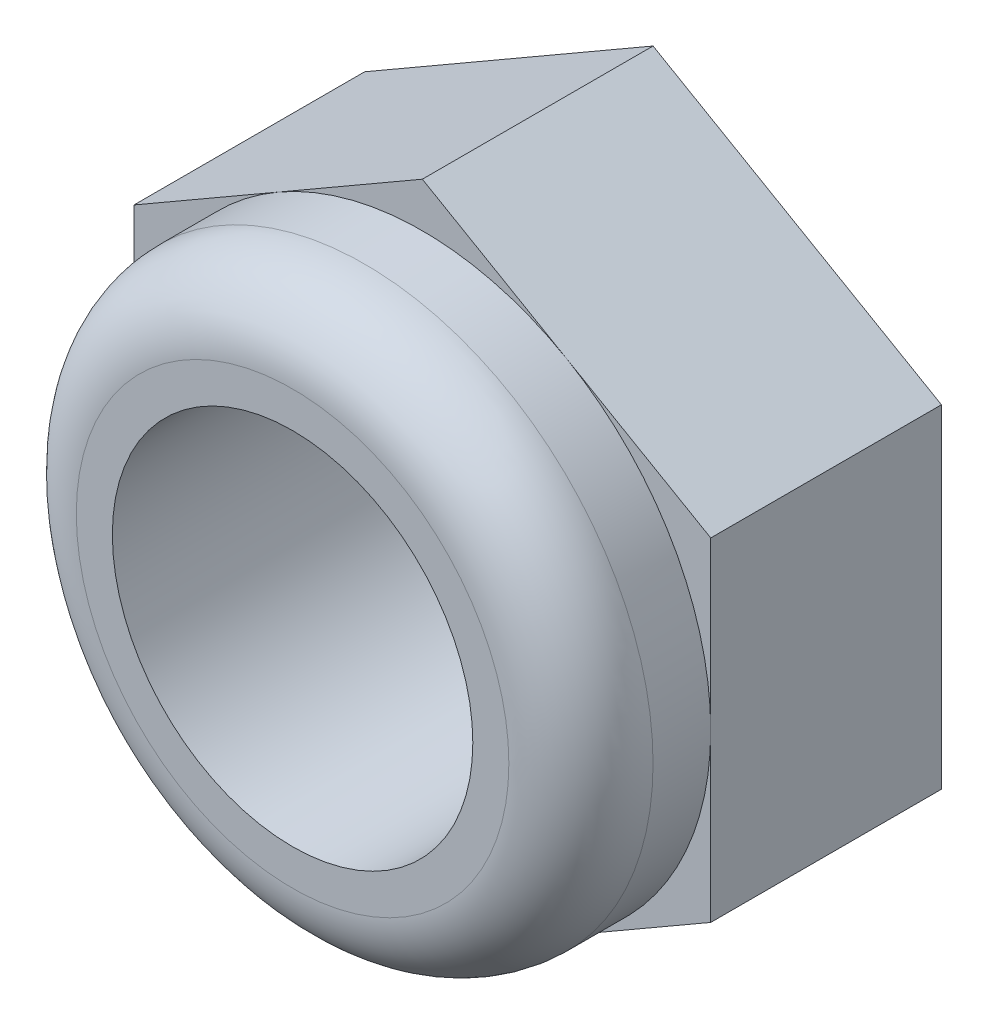
ISO-10303-21;
HEADER;
FILE_DESCRIPTION(('STEP AP214'),'2;1');
FILE_NAME('part.step','',(''),(''),'','','');
FILE_SCHEMA(('AUTOMOTIVE_DESIGN { 1 0 10303 214 1 1 1 1 }'));
ENDSEC;
DATA;
#1=APPLICATION_CONTEXT('core data for automotive mechanical design processes');
#2=APPLICATION_PROTOCOL_DEFINITION('international standard','automotive_design',2000,#1);
#3=PRODUCT_CONTEXT('',#1,'mechanical');
#4=PRODUCT('Part','Part','',(#3));
#5=PRODUCT_RELATED_PRODUCT_CATEGORY('part','',(#4));
#6=PRODUCT_DEFINITION_FORMATION('','',#4);
#7=PRODUCT_DEFINITION_CONTEXT('part definition',#1,'design');
#8=PRODUCT_DEFINITION('design','',#6,#7);
#9=PRODUCT_DEFINITION_SHAPE('','',#8);
#10=(LENGTH_UNIT() NAMED_UNIT(*) SI_UNIT(.MILLI.,.METRE.));
#11=(NAMED_UNIT(*) PLANE_ANGLE_UNIT() SI_UNIT($,.RADIAN.));
#12=(NAMED_UNIT(*) SI_UNIT($,.STERADIAN.) SOLID_ANGLE_UNIT());
#13=UNCERTAINTY_MEASURE_WITH_UNIT(LENGTH_MEASURE(1.E-05),#10,'distance_accuracy_value','');
#14=(GEOMETRIC_REPRESENTATION_CONTEXT(3) GLOBAL_UNCERTAINTY_ASSIGNED_CONTEXT((#13)) GLOBAL_UNIT_ASSIGNED_CONTEXT((#10,
#11,#12)) REPRESENTATION_CONTEXT('',''));
#15=CARTESIAN_POINT('',(0.,0.,0.));
#16=DIRECTION('',(0.,0.,1.));
#17=DIRECTION('',(1.,0.,0.));
#18=AXIS2_PLACEMENT_3D('',#15,#16,#17);
#19=CARTESIAN_POINT('',(0.,0.,3.2));
#20=DIRECTION('',(0.,0.,1.));
#21=DIRECTION('',(1.,0.,0.));
#22=AXIS2_PLACEMENT_3D('',#19,#20,#21);
#23=PLANE('',#22);
#24=CARTESIAN_POINT('',(0.,0.,3.2));
#25=DIRECTION('',(0.,0.,1.));
#26=DIRECTION('',(1.,0.,0.));
#27=AXIS2_PLACEMENT_3D('',#24,#25,#26);
#28=CIRCLE('',#27,4.);
#29=CARTESIAN_POINT('',(4.,0.,3.2));
#30=VERTEX_POINT('',#29);
#31=CARTESIAN_POINT('',(2.,3.46410161513776,3.2));
#32=VERTEX_POINT('',#31);
#33=EDGE_CURVE('E131',#30,#32,#28,.T.);
#34=ORIENTED_EDGE('',*,*,#33,.F.);
#35=DIRECTION('',(0.,1.,0.));
#36=VECTOR('',#35,1.);
#37=CARTESIAN_POINT('',(4.,-2.3094010767585,3.2));
#38=LINE('',#37,#36);
#39=CARTESIAN_POINT('',(4.,2.30940107675851,3.2));
#40=VERTEX_POINT('',#39);
#41=EDGE_CURVE('E119',#30,#40,#38,.T.);
#42=ORIENTED_EDGE('',*,*,#41,.T.);
#43=DIRECTION('',(-0.866025403784439,0.5,0.));
#44=VECTOR('',#43,1.);
#45=CARTESIAN_POINT('',(4.,2.30940107675851,3.2));
#46=LINE('',#45,#44);
#47=EDGE_CURVE('E132',#40,#32,#46,.T.);
#48=ORIENTED_EDGE('',*,*,#47,.T.);
#49=EDGE_LOOP('',(#34,#42,#48));
#50=FACE_BOUND('',#49,.T.);
#51=ADVANCED_FACE('F36',(#50),#23,.T.);
#52=CARTESIAN_POINT('',(-2.,3.46410161513775,3.2));
#53=VERTEX_POINT('',#52);
#54=EDGE_CURVE('E138',#32,#53,#28,.T.);
#55=ORIENTED_EDGE('',*,*,#54,.F.);
#56=CARTESIAN_POINT('',(0.,4.61880215351701,3.2));
#57=VERTEX_POINT('',#56);
#58=EDGE_CURVE('E118',#32,#57,#46,.T.);
#59=ORIENTED_EDGE('',*,*,#58,.T.);
#60=DIRECTION('',(-0.866025403784438,-0.5,0.));
#61=VECTOR('',#60,1.);
#62=CARTESIAN_POINT('',(0.,4.61880215351701,3.2));
#63=LINE('',#62,#61);
#64=EDGE_CURVE('E149',#57,#53,#63,.T.);
#65=ORIENTED_EDGE('',*,*,#64,.T.);
#66=EDGE_LOOP('',(#55,#59,#65));
#67=FACE_BOUND('',#66,.T.);
#68=ADVANCED_FACE('F197',(#67),#23,.T.);
#69=CARTESIAN_POINT('',(-4.,0.,3.2));
#70=VERTEX_POINT('',#69);
#71=EDGE_CURVE('E186',#53,#70,#28,.T.);
#72=ORIENTED_EDGE('',*,*,#71,.F.);
#73=CARTESIAN_POINT('',(-4.,2.3094010767585,3.2));
#74=VERTEX_POINT('',#73);
#75=EDGE_CURVE('E148',#53,#74,#63,.T.);
#76=ORIENTED_EDGE('',*,*,#75,.T.);
#77=DIRECTION('',(0.,-1.,0.));
#78=VECTOR('',#77,1.);
#79=CARTESIAN_POINT('',(-4.,2.3094010767585,3.2));
#80=LINE('',#79,#78);
#81=EDGE_CURVE('E153',#74,#70,#80,.T.);
#82=ORIENTED_EDGE('',*,*,#81,.T.);
#83=EDGE_LOOP('',(#72,#76,#82));
#84=FACE_BOUND('',#83,.T.);
#85=ADVANCED_FACE('F190',(#84),#23,.T.);
#86=CARTESIAN_POINT('',(-2.,-3.46410161513776,3.2));
#87=VERTEX_POINT('',#86);
#88=EDGE_CURVE('E59',#70,#87,#28,.T.);
#89=ORIENTED_EDGE('',*,*,#88,.F.);
#90=CARTESIAN_POINT('',(-4.,-2.3094010767585,3.2));
#91=VERTEX_POINT('',#90);
#92=EDGE_CURVE('E152',#70,#91,#80,.T.);
#93=ORIENTED_EDGE('',*,*,#92,.T.);
#94=DIRECTION('',(0.866025403784439,-0.5,0.));
#95=VECTOR('',#94,1.);
#96=CARTESIAN_POINT('',(-4.,-2.3094010767585,3.2));
#97=LINE('',#96,#95);
#98=EDGE_CURVE('E157',#91,#87,#97,.T.);
#99=ORIENTED_EDGE('',*,*,#98,.T.);
#100=EDGE_LOOP('',(#89,#93,#99));
#101=FACE_BOUND('',#100,.T.);
#102=ADVANCED_FACE('F216',(#101),#23,.T.);
#103=CARTESIAN_POINT('',(2.,-3.46410161513775,3.2));
#104=VERTEX_POINT('',#103);
#105=EDGE_CURVE('E51',#87,#104,#28,.T.);
#106=ORIENTED_EDGE('',*,*,#105,.F.);
#107=CARTESIAN_POINT('',(0.,-4.61880215351701,3.2));
#108=VERTEX_POINT('',#107);
#109=EDGE_CURVE('E156',#87,#108,#97,.T.);
#110=ORIENTED_EDGE('',*,*,#109,.T.);
#111=DIRECTION('',(0.866025403784438,0.500000000000001,0.));
#112=VECTOR('',#111,1.);
#113=CARTESIAN_POINT('',(0.,-4.61880215351701,3.2));
#114=LINE('',#113,#112);
#115=EDGE_CURVE('E129',#108,#104,#114,.T.);
#116=ORIENTED_EDGE('',*,*,#115,.T.);
#117=EDGE_LOOP('',(#106,#110,#116));
#118=FACE_BOUND('',#117,.T.);
#119=ADVANCED_FACE('F218',(#118),#23,.T.);
#120=CARTESIAN_POINT('',(0.,-4.61880215351701,3.2));
#121=DIRECTION('',(-0.500000000000001,0.866025403784438,0.));
#122=DIRECTION('',(-0.866025403784438,-0.500000000000001,0.));
#123=AXIS2_PLACEMENT_3D('',#120,#121,#122);
#124=PLANE('',#123);
#125=DIRECTION('',(0.866025403784438,0.500000000000001,0.));
#126=VECTOR('',#125,1.);
#127=CARTESIAN_POINT('',(0.,-4.61880215351701,0.));
#128=LINE('',#127,#126);
#129=CARTESIAN_POINT('',(0.,-4.61880215351701,0.));
#130=VERTEX_POINT('',#129);
#131=CARTESIAN_POINT('',(4.,-2.3094010767585,0.));
#132=VERTEX_POINT('',#131);
#133=EDGE_CURVE('E135',#130,#132,#128,.T.);
#134=ORIENTED_EDGE('',*,*,#133,.T.);
#135=DIRECTION('',(0.,0.,-1.));
#136=VECTOR('',#135,1.);
#137=CARTESIAN_POINT('',(4.,-2.3094010767585,3.2));
#138=LINE('',#137,#136);
#139=CARTESIAN_POINT('',(4.,-2.3094010767585,3.2));
#140=VERTEX_POINT('',#139);
#141=EDGE_CURVE('E140',#140,#132,#138,.T.);
#142=ORIENTED_EDGE('',*,*,#141,.F.);
#143=EDGE_CURVE('E114',#104,#140,#114,.T.);
#144=ORIENTED_EDGE('',*,*,#143,.F.);
#145=ORIENTED_EDGE('',*,*,#115,.F.);
#146=DIRECTION('',(0.,0.,-1.));
#147=VECTOR('',#146,1.);
#148=CARTESIAN_POINT('',(0.,-4.61880215351701,3.2));
#149=LINE('',#148,#147);
#150=EDGE_CURVE('E159',#108,#130,#149,.T.);
#151=ORIENTED_EDGE('',*,*,#150,.T.);
#152=EDGE_LOOP('',(#134,#142,#144,#145,#151));
#153=FACE_BOUND('',#152,.T.);
#154=ADVANCED_FACE('F224',(#153),#124,.F.);
#155=CARTESIAN_POINT('',(4.,-2.3094010767585,3.2));
#156=DIRECTION('',(-1.,0.,0.));
#157=DIRECTION('',(0.,-1.,0.));
#158=AXIS2_PLACEMENT_3D('',#155,#156,#157);
#159=PLANE('',#158);
#160=DIRECTION('',(0.,1.,0.));
#161=VECTOR('',#160,1.);
#162=CARTESIAN_POINT('',(4.,-2.3094010767585,0.));
#163=LINE('',#162,#161);
#164=CARTESIAN_POINT('',(4.,2.30940107675851,0.));
#165=VERTEX_POINT('',#164);
#166=EDGE_CURVE('E162',#132,#165,#163,.T.);
#167=ORIENTED_EDGE('',*,*,#166,.T.);
#168=DIRECTION('',(0.,0.,-1.));
#169=VECTOR('',#168,1.);
#170=CARTESIAN_POINT('',(4.,2.30940107675851,3.2));
#171=LINE('',#170,#169);
#172=EDGE_CURVE('E125',#40,#165,#171,.T.);
#173=ORIENTED_EDGE('',*,*,#172,.F.);
#174=ORIENTED_EDGE('',*,*,#41,.F.);
#175=EDGE_CURVE('E108',#140,#30,#38,.T.);
#176=ORIENTED_EDGE('',*,*,#175,.F.);
#177=ORIENTED_EDGE('',*,*,#141,.T.);
#178=EDGE_LOOP('',(#167,#173,#174,#176,#177));
#179=FACE_BOUND('',#178,.T.);
#180=ADVANCED_FACE('F123',(#179),#159,.F.);
#181=CARTESIAN_POINT('',(4.,2.30940107675851,3.2));
#182=DIRECTION('',(-0.5,-0.866025403784439,0.));
#183=DIRECTION('',(0.866025403784439,-0.5,0.));
#184=AXIS2_PLACEMENT_3D('',#181,#182,#183);
#185=PLANE('',#184);
#186=DIRECTION('',(-0.866025403784439,0.5,0.));
#187=VECTOR('',#186,1.);
#188=CARTESIAN_POINT('',(4.,2.30940107675851,0.));
#189=LINE('',#188,#187);
#190=CARTESIAN_POINT('',(0.,4.61880215351701,0.));
#191=VERTEX_POINT('',#190);
#192=EDGE_CURVE('E164',#165,#191,#189,.T.);
#193=ORIENTED_EDGE('',*,*,#192,.T.);
#194=DIRECTION('',(0.,0.,-1.));
#195=VECTOR('',#194,1.);
#196=CARTESIAN_POINT('',(0.,4.61880215351701,3.2));
#197=LINE('',#196,#195);
#198=EDGE_CURVE('E180',#57,#191,#197,.T.);
#199=ORIENTED_EDGE('',*,*,#198,.F.);
#200=ORIENTED_EDGE('',*,*,#58,.F.);
#201=ORIENTED_EDGE('',*,*,#47,.F.);
#202=ORIENTED_EDGE('',*,*,#172,.T.);
#203=EDGE_LOOP('',(#193,#199,#200,#201,#202));
#204=FACE_BOUND('',#203,.T.);
#205=ADVANCED_FACE('F201',(#204),#185,.F.);
#206=CARTESIAN_POINT('',(0.,4.61880215351701,3.2));
#207=DIRECTION('',(0.5,-0.866025403784438,0.));
#208=DIRECTION('',(0.866025403784439,0.5,0.));
#209=AXIS2_PLACEMENT_3D('',#206,#207,#208);
#210=PLANE('',#209);
#211=DIRECTION('',(-0.866025403784438,-0.5,0.));
#212=VECTOR('',#211,1.);
#213=CARTESIAN_POINT('',(0.,4.61880215351701,0.));
#214=LINE('',#213,#212);
#215=CARTESIAN_POINT('',(-4.,2.3094010767585,0.));
#216=VERTEX_POINT('',#215);
#217=EDGE_CURVE('E166',#191,#216,#214,.T.);
#218=ORIENTED_EDGE('',*,*,#217,.T.);
#219=DIRECTION('',(0.,0.,-1.));
#220=VECTOR('',#219,1.);
#221=CARTESIAN_POINT('',(-4.,2.3094010767585,3.2));
#222=LINE('',#221,#220);
#223=EDGE_CURVE('E177',#74,#216,#222,.T.);
#224=ORIENTED_EDGE('',*,*,#223,.F.);
#225=ORIENTED_EDGE('',*,*,#75,.F.);
#226=ORIENTED_EDGE('',*,*,#64,.F.);
#227=ORIENTED_EDGE('',*,*,#198,.T.);
#228=EDGE_LOOP('',(#218,#224,#225,#226,#227));
#229=FACE_BOUND('',#228,.T.);
#230=ADVANCED_FACE('F195',(#229),#210,.F.);
#231=CARTESIAN_POINT('',(-4.,2.3094010767585,3.2));
#232=DIRECTION('',(1.,0.,0.));
#233=DIRECTION('',(0.,1.,0.));
#234=AXIS2_PLACEMENT_3D('',#231,#232,#233);
#235=PLANE('',#234);
#236=DIRECTION('',(0.,-1.,0.));
#237=VECTOR('',#236,1.);
#238=CARTESIAN_POINT('',(-4.,2.3094010767585,0.));
#239=LINE('',#238,#237);
#240=CARTESIAN_POINT('',(-4.,-2.3094010767585,0.));
#241=VERTEX_POINT('',#240);
#242=EDGE_CURVE('E168',#216,#241,#239,.T.);
#243=ORIENTED_EDGE('',*,*,#242,.T.);
#244=DIRECTION('',(0.,0.,-1.));
#245=VECTOR('',#244,1.);
#246=CARTESIAN_POINT('',(-4.,-2.3094010767585,3.2));
#247=LINE('',#246,#245);
#248=EDGE_CURVE('E174',#91,#241,#247,.T.);
#249=ORIENTED_EDGE('',*,*,#248,.F.);
#250=ORIENTED_EDGE('',*,*,#92,.F.);
#251=ORIENTED_EDGE('',*,*,#81,.F.);
#252=ORIENTED_EDGE('',*,*,#223,.T.);
#253=EDGE_LOOP('',(#243,#249,#250,#251,#252));
#254=FACE_BOUND('',#253,.T.);
#255=ADVANCED_FACE('F211',(#254),#235,.F.);
#256=CARTESIAN_POINT('',(-4.,-2.3094010767585,3.2));
#257=DIRECTION('',(0.5,0.866025403784439,0.));
#258=DIRECTION('',(-0.866025403784439,0.5,0.));
#259=AXIS2_PLACEMENT_3D('',#256,#257,#258);
#260=PLANE('',#259);
#261=DIRECTION('',(0.866025403784439,-0.5,0.));
#262=VECTOR('',#261,1.);
#263=CARTESIAN_POINT('',(-4.,-2.3094010767585,0.));
#264=LINE('',#263,#262);
#265=EDGE_CURVE('E170',#241,#130,#264,.T.);
#266=ORIENTED_EDGE('',*,*,#265,.T.);
#267=ORIENTED_EDGE('',*,*,#150,.F.);
#268=ORIENTED_EDGE('',*,*,#109,.F.);
#269=ORIENTED_EDGE('',*,*,#98,.F.);
#270=ORIENTED_EDGE('',*,*,#248,.T.);
#271=EDGE_LOOP('',(#266,#267,#268,#269,#270));
#272=FACE_BOUND('',#271,.T.);
#273=ADVANCED_FACE('F214',(#272),#260,.F.);
#274=EDGE_CURVE('E112',#104,#30,#28,.T.);
#275=ORIENTED_EDGE('',*,*,#274,.F.);
#276=ORIENTED_EDGE('',*,*,#143,.T.);
#277=ORIENTED_EDGE('',*,*,#175,.T.);
#278=EDGE_LOOP('',(#275,#276,#277));
#279=FACE_BOUND('',#278,.T.);
#280=ADVANCED_FACE('F110',(#279),#23,.T.);
#281=CARTESIAN_POINT('',(0.,0.,0.));
#282=DIRECTION('',(0.,0.,1.));
#283=DIRECTION('',(1.,0.,0.));
#284=AXIS2_PLACEMENT_3D('',#281,#282,#283);
#285=PLANE('',#284);
#286=CARTESIAN_POINT('',(0.,0.,0.));
#287=DIRECTION('',(0.,0.,1.));
#288=DIRECTION('',(1.,0.,0.));
#289=AXIS2_PLACEMENT_3D('',#286,#287,#288);
#290=CIRCLE('',#289,2.5);
#291=CARTESIAN_POINT('',(2.5,0.,0.));
#292=VERTEX_POINT('',#291);
#293=EDGE_CURVE('E136',#292,#292,#290,.T.);
#294=ORIENTED_EDGE('',*,*,#293,.T.);
#295=EDGE_LOOP('',(#294));
#296=FACE_BOUND('',#295,.T.);
#297=ORIENTED_EDGE('',*,*,#133,.F.);
#298=ORIENTED_EDGE('',*,*,#265,.F.);
#299=ORIENTED_EDGE('',*,*,#242,.F.);
#300=ORIENTED_EDGE('',*,*,#217,.F.);
#301=ORIENTED_EDGE('',*,*,#192,.F.);
#302=ORIENTED_EDGE('',*,*,#166,.F.);
#303=EDGE_LOOP('',(#297,#298,#299,#300,#301,#302));
#304=FACE_BOUND('',#303,.T.);
#305=ADVANCED_FACE('F207',(#296,#304),#285,.F.);
#306=CARTESIAN_POINT('',(0.,0.,5.));
#307=DIRECTION('',(0.,0.,-1.));
#308=DIRECTION('',(-1.,0.,0.));
#309=AXIS2_PLACEMENT_3D('',#306,#307,#308);
#310=CYLINDRICAL_SURFACE('',#309,4.);
#311=CARTESIAN_POINT('',(0.,0.,4.));
#312=DIRECTION('',(0.,0.,1.));
#313=DIRECTION('',(1.,0.,0.));
#314=AXIS2_PLACEMENT_3D('',#311,#312,#313);
#315=CIRCLE('',#314,4.);
#316=CARTESIAN_POINT('',(4.,0.,4.));
#317=VERTEX_POINT('',#316);
#318=EDGE_CURVE('E11',#317,#317,#315,.F.);
#319=ORIENTED_EDGE('',*,*,#318,.T.);
#320=EDGE_LOOP('',(#319));
#321=FACE_BOUND('',#320,.T.);
#322=ORIENTED_EDGE('',*,*,#33,.T.);
#323=ORIENTED_EDGE('',*,*,#54,.T.);
#324=ORIENTED_EDGE('',*,*,#71,.T.);
#325=ORIENTED_EDGE('',*,*,#88,.T.);
#326=ORIENTED_EDGE('',*,*,#105,.T.);
#327=ORIENTED_EDGE('',*,*,#274,.T.);
#328=EDGE_LOOP('',(#322,#323,#324,#325,#326,#327));
#329=FACE_BOUND('',#328,.T.);
#330=ADVANCED_FACE('F139',(#321,#329),#310,.T.);
#331=CARTESIAN_POINT('',(0.,0.,5.));
#332=DIRECTION('',(0.,0.,1.));
#333=DIRECTION('',(1.,0.,0.));
#334=AXIS2_PLACEMENT_3D('',#331,#332,#333);
#335=PLANE('',#334);
#336=CARTESIAN_POINT('',(0.,0.,5.));
#337=DIRECTION('',(0.,0.,1.));
#338=DIRECTION('',(1.,0.,0.));
#339=AXIS2_PLACEMENT_3D('',#336,#337,#338);
#340=CIRCLE('',#339,3.);
#341=CARTESIAN_POINT('',(3.,0.,5.));
#342=VERTEX_POINT('',#341);
#343=EDGE_CURVE('E44',#342,#342,#340,.T.);
#344=ORIENTED_EDGE('',*,*,#343,.T.);
#345=EDGE_LOOP('',(#344));
#346=FACE_BOUND('',#345,.T.);
#347=CARTESIAN_POINT('',(0.,0.,5.));
#348=DIRECTION('',(0.,0.,1.));
#349=DIRECTION('',(1.,0.,0.));
#350=AXIS2_PLACEMENT_3D('',#347,#348,#349);
#351=CIRCLE('',#350,2.5);
#352=CARTESIAN_POINT('',(2.5,0.,5.));
#353=VERTEX_POINT('',#352);
#354=EDGE_CURVE('E144',#353,#353,#351,.T.);
#355=ORIENTED_EDGE('',*,*,#354,.F.);
#356=EDGE_LOOP('',(#355));
#357=FACE_BOUND('',#356,.T.);
#358=ADVANCED_FACE('F297',(#346,#357),#335,.T.);
#359=CARTESIAN_POINT('',(0.,0.,0.));
#360=DIRECTION('',(0.,0.,1.));
#361=DIRECTION('',(1.,0.,0.));
#362=AXIS2_PLACEMENT_3D('',#359,#360,#361);
#363=CYLINDRICAL_SURFACE('',#362,2.5);
#364=ORIENTED_EDGE('',*,*,#293,.F.);
#365=EDGE_LOOP('',(#364));
#366=FACE_BOUND('',#365,.T.);
#367=ORIENTED_EDGE('',*,*,#354,.T.);
#368=EDGE_LOOP('',(#367));
#369=FACE_BOUND('',#368,.T.);
#370=ADVANCED_FACE('F292',(#366,#369),#363,.F.);
#371=CARTESIAN_POINT('',(0.,0.,4.));
#372=DIRECTION('',(0.,0.,1.));
#373=DIRECTION('',(1.,0.,0.));
#374=AXIS2_PLACEMENT_3D('',#371,#372,#373);
#375=TOROIDAL_SURFACE('',#374,3.,1.);
#376=ORIENTED_EDGE('',*,*,#318,.F.);
#377=EDGE_LOOP('',(#376));
#378=FACE_BOUND('',#377,.T.);
#379=ORIENTED_EDGE('',*,*,#343,.F.);
#380=EDGE_LOOP('',(#379));
#381=FACE_BOUND('',#380,.T.);
#382=ADVANCED_FACE('F38',(#378,#381),#375,.T.);
#383=CLOSED_SHELL('',(#51,#68,#85,#102,#119,#154,#180,#205,#230,#255,#273,#280,#305,#330,#358,
#370,#382));
#384=MANIFOLD_SOLID_BREP('B2',#383);
#385=ADVANCED_BREP_SHAPE_REPRESENTATION('',(#18,#384),#14);
#386=SHAPE_DEFINITION_REPRESENTATION(#9,#385);
ENDSEC;
END-ISO-10303-21;
